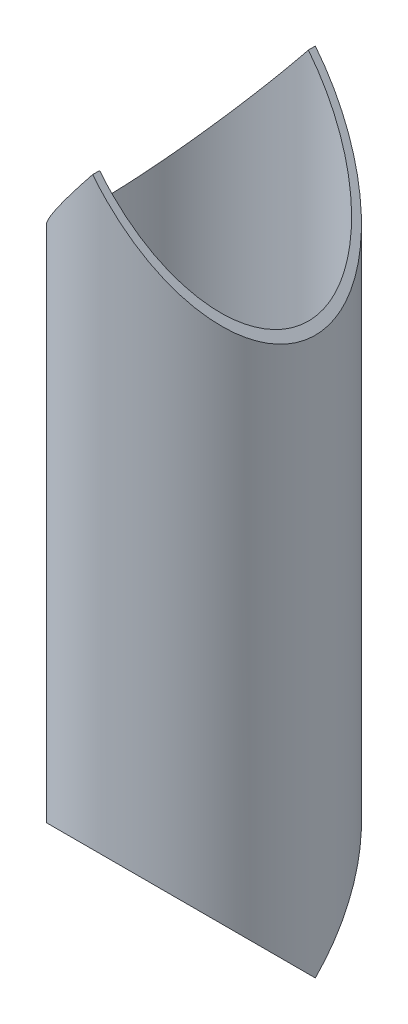
ISO-10303-21;
HEADER;
FILE_DESCRIPTION(('STEP AP214'),'2;1');
FILE_NAME('part.step','',(''),(''),'','','');
FILE_SCHEMA(('AUTOMOTIVE_DESIGN { 1 0 10303 214 1 1 1 1 }'));
ENDSEC;
DATA;
#1=APPLICATION_CONTEXT('core data for automotive mechanical design processes');
#2=APPLICATION_PROTOCOL_DEFINITION('international standard','automotive_design',2000,#1);
#3=PRODUCT_CONTEXT('',#1,'mechanical');
#4=PRODUCT('Part','Part','',(#3));
#5=PRODUCT_RELATED_PRODUCT_CATEGORY('part','',(#4));
#6=PRODUCT_DEFINITION_FORMATION('','',#4);
#7=PRODUCT_DEFINITION_CONTEXT('part definition',#1,'design');
#8=PRODUCT_DEFINITION('design','',#6,#7);
#9=PRODUCT_DEFINITION_SHAPE('','',#8);
#10=(LENGTH_UNIT() NAMED_UNIT(*) SI_UNIT(.MILLI.,.METRE.));
#11=(NAMED_UNIT(*) PLANE_ANGLE_UNIT() SI_UNIT($,.RADIAN.));
#12=(NAMED_UNIT(*) SI_UNIT($,.STERADIAN.) SOLID_ANGLE_UNIT());
#13=UNCERTAINTY_MEASURE_WITH_UNIT(LENGTH_MEASURE(1.E-05),#10,'distance_accuracy_value','');
#14=(GEOMETRIC_REPRESENTATION_CONTEXT(3) GLOBAL_UNCERTAINTY_ASSIGNED_CONTEXT((#13)) GLOBAL_UNIT_ASSIGNED_CONTEXT((#10,
#11,#12)) REPRESENTATION_CONTEXT('',''));
#15=CARTESIAN_POINT('',(0.,0.,0.));
#16=DIRECTION('',(0.,0.,1.));
#17=DIRECTION('',(1.,0.,0.));
#18=AXIS2_PLACEMENT_3D('',#15,#16,#17);
#19=CARTESIAN_POINT('',(0.,158.75,0.));
#20=DIRECTION('',(0.,-1.,0.));
#21=DIRECTION('',(0.,0.,-1.));
#22=AXIS2_PLACEMENT_3D('',#19,#20,#21);
#23=CYLINDRICAL_SURFACE('',#22,25.4);
#24=CARTESIAN_POINT('',(0.,158.75,0.));
#25=DIRECTION('',(0.78086880944303,-0.624695047554424,0.));
#26=DIRECTION('',(-0.624695047554424,-0.78086880944303,0.));
#27=AXIS2_PLACEMENT_3D('',#24,#25,#26);
#28=ELLIPSE('',#27,40.6598389076986,25.4);
#29=CARTESIAN_POINT('',(0.,158.75,25.4));
#30=VERTEX_POINT('',#29);
#31=CARTESIAN_POINT('',(0.,158.75,-25.4));
#32=VERTEX_POINT('',#31);
#33=EDGE_CURVE('E86',#30,#32,#28,.T.);
#34=ORIENTED_EDGE('',*,*,#33,.T.);
#35=CARTESIAN_POINT('',(0.,158.75,0.));
#36=DIRECTION('',(-0.78086880944303,-0.624695047554424,0.));
#37=DIRECTION('',(0.624695047554424,-0.78086880944303,0.));
#38=AXIS2_PLACEMENT_3D('',#35,#36,#37);
#39=ELLIPSE('',#38,40.6598389076986,25.4);
#40=EDGE_CURVE('E84',#32,#30,#39,.T.);
#41=ORIENTED_EDGE('',*,*,#40,.T.);
#42=EDGE_LOOP('',(#34,#41));
#43=FACE_BOUND('',#42,.T.);
#44=CARTESIAN_POINT('',(0.,0.,0.));
#45=DIRECTION('',(0.,0.707106781186548,0.707106781186548));
#46=DIRECTION('',(0.,-0.707106781186548,0.707106781186548));
#47=AXIS2_PLACEMENT_3D('',#44,#45,#46);
#48=ELLIPSE('',#47,35.9210244842766,25.4);
#49=CARTESIAN_POINT('',(25.4,0.,0.));
#50=VERTEX_POINT('',#49);
#51=CARTESIAN_POINT('',(-25.4,0.,0.));
#52=VERTEX_POINT('',#51);
#53=EDGE_CURVE('E45',#50,#52,#48,.T.);
#54=ORIENTED_EDGE('',*,*,#53,.T.);
#55=CARTESIAN_POINT('',(0.,0.,0.));
#56=DIRECTION('',(0.,0.707106781186548,-0.707106781186548));
#57=DIRECTION('',(0.,-0.707106781186548,-0.707106781186548));
#58=AXIS2_PLACEMENT_3D('',#55,#56,#57);
#59=ELLIPSE('',#58,35.9210244842766,25.4);
#60=EDGE_CURVE('E69',#52,#50,#59,.T.);
#61=ORIENTED_EDGE('',*,*,#60,.T.);
#62=EDGE_LOOP('',(#54,#61));
#63=FACE_BOUND('',#62,.T.);
#64=ADVANCED_FACE('F32',(#43,#63),#23,.T.);
#65=CARTESIAN_POINT('',(0.,158.75,0.));
#66=DIRECTION('',(0.,-1.,0.));
#67=DIRECTION('',(0.,0.,-1.));
#68=AXIS2_PLACEMENT_3D('',#65,#66,#67);
#69=CYLINDRICAL_SURFACE('',#68,23.8125);
#70=CARTESIAN_POINT('',(0.,0.,0.));
#71=DIRECTION('',(0.,0.707106781186548,-0.707106781186548));
#72=DIRECTION('',(0.,-0.707106781186548,-0.707106781186548));
#73=AXIS2_PLACEMENT_3D('',#70,#71,#72);
#74=ELLIPSE('',#73,33.6759604540093,23.8125);
#75=CARTESIAN_POINT('',(-23.8125,0.,0.));
#76=VERTEX_POINT('',#75);
#77=CARTESIAN_POINT('',(23.8125,0.,0.));
#78=VERTEX_POINT('',#77);
#79=EDGE_CURVE('E11',#76,#78,#74,.T.);
#80=ORIENTED_EDGE('',*,*,#79,.F.);
#81=CARTESIAN_POINT('',(0.,0.,0.));
#82=DIRECTION('',(0.,0.707106781186548,0.707106781186548));
#83=DIRECTION('',(0.,-0.707106781186548,0.707106781186548));
#84=AXIS2_PLACEMENT_3D('',#81,#82,#83);
#85=ELLIPSE('',#84,33.6759604540093,23.8125);
#86=EDGE_CURVE('E39',#78,#76,#85,.T.);
#87=ORIENTED_EDGE('',*,*,#86,.F.);
#88=EDGE_LOOP('',(#80,#87));
#89=FACE_BOUND('',#88,.T.);
#90=CARTESIAN_POINT('',(0.,158.75,0.));
#91=DIRECTION('',(0.78086880944303,-0.624695047554424,0.));
#92=DIRECTION('',(-0.624695047554424,-0.78086880944303,0.));
#93=AXIS2_PLACEMENT_3D('',#90,#91,#92);
#94=ELLIPSE('',#93,38.1185989759674,23.8125);
#95=CARTESIAN_POINT('',(0.,158.75,23.8125));
#96=VERTEX_POINT('',#95);
#97=CARTESIAN_POINT('',(0.,158.75,-23.8125));
#98=VERTEX_POINT('',#97);
#99=EDGE_CURVE('E90',#96,#98,#94,.T.);
#100=ORIENTED_EDGE('',*,*,#99,.F.);
#101=CARTESIAN_POINT('',(0.,158.75,0.));
#102=DIRECTION('',(-0.78086880944303,-0.624695047554424,0.));
#103=DIRECTION('',(0.624695047554424,-0.78086880944303,0.));
#104=AXIS2_PLACEMENT_3D('',#101,#102,#103);
#105=ELLIPSE('',#104,38.1185989759674,23.8125);
#106=EDGE_CURVE('E88',#98,#96,#105,.T.);
#107=ORIENTED_EDGE('',*,*,#106,.F.);
#108=EDGE_LOOP('',(#100,#107));
#109=FACE_BOUND('',#108,.T.);
#110=ADVANCED_FACE('F93',(#89,#109),#69,.F.);
#111=CARTESIAN_POINT('',(-25.4,127.,-25.4));
#112=DIRECTION('',(0.78086880944303,-0.624695047554424,0.));
#113=DIRECTION('',(0.624695047554424,0.78086880944303,0.));
#114=AXIS2_PLACEMENT_3D('',#111,#112,#113);
#115=PLANE('',#114);
#116=ORIENTED_EDGE('',*,*,#33,.F.);
#117=DIRECTION('',(0.,0.,1.));
#118=VECTOR('',#117,1.);
#119=CARTESIAN_POINT('',(0.,158.75,-25.4));
#120=LINE('',#119,#118);
#121=EDGE_CURVE('E72',#96,#30,#120,.T.);
#122=ORIENTED_EDGE('',*,*,#121,.F.);
#123=ORIENTED_EDGE('',*,*,#99,.T.);
#124=EDGE_CURVE('E82',#32,#98,#120,.T.);
#125=ORIENTED_EDGE('',*,*,#124,.F.);
#126=EDGE_LOOP('',(#116,#122,#123,#125));
#127=FACE_BOUND('',#126,.T.);
#128=ADVANCED_FACE('F96',(#127),#115,.F.);
#129=CARTESIAN_POINT('',(0.,158.75,-25.4));
#130=DIRECTION('',(-0.78086880944303,-0.624695047554424,0.));
#131=DIRECTION('',(0.624695047554424,-0.78086880944303,0.));
#132=AXIS2_PLACEMENT_3D('',#129,#130,#131);
#133=PLANE('',#132);
#134=ORIENTED_EDGE('',*,*,#40,.F.);
#135=ORIENTED_EDGE('',*,*,#124,.T.);
#136=ORIENTED_EDGE('',*,*,#106,.T.);
#137=ORIENTED_EDGE('',*,*,#121,.T.);
#138=EDGE_LOOP('',(#134,#135,#136,#137));
#139=FACE_BOUND('',#138,.T.);
#140=ADVANCED_FACE('F106',(#139),#133,.F.);
#141=CARTESIAN_POINT('',(-25.4,0.,0.));
#142=DIRECTION('',(0.,0.707106781186548,-0.707106781186548));
#143=DIRECTION('',(0.,0.707106781186548,0.707106781186548));
#144=AXIS2_PLACEMENT_3D('',#141,#142,#143);
#145=PLANE('',#144);
#146=DIRECTION('',(1.,0.,0.));
#147=VECTOR('',#146,1.);
#148=CARTESIAN_POINT('',(-25.4,0.,0.));
#149=LINE('',#148,#147);
#150=EDGE_CURVE('E75',#52,#76,#149,.T.);
#151=ORIENTED_EDGE('',*,*,#150,.T.);
#152=ORIENTED_EDGE('',*,*,#79,.T.);
#153=EDGE_CURVE('E52',#78,#50,#149,.T.);
#154=ORIENTED_EDGE('',*,*,#153,.T.);
#155=ORIENTED_EDGE('',*,*,#60,.F.);
#156=EDGE_LOOP('',(#151,#152,#154,#155));
#157=FACE_BOUND('',#156,.T.);
#158=ADVANCED_FACE('F77',(#157),#145,.F.);
#159=CARTESIAN_POINT('',(-25.4,25.4,-25.4));
#160=DIRECTION('',(0.,0.707106781186548,0.707106781186548));
#161=DIRECTION('',(0.,-0.707106781186548,0.707106781186548));
#162=AXIS2_PLACEMENT_3D('',#159,#160,#161);
#163=PLANE('',#162);
#164=ORIENTED_EDGE('',*,*,#153,.F.);
#165=ORIENTED_EDGE('',*,*,#86,.T.);
#166=ORIENTED_EDGE('',*,*,#150,.F.);
#167=ORIENTED_EDGE('',*,*,#53,.F.);
#168=EDGE_LOOP('',(#164,#165,#166,#167));
#169=FACE_BOUND('',#168,.T.);
#170=ADVANCED_FACE('F74',(#169),#163,.F.);
#171=CLOSED_SHELL('',(#64,#110,#128,#140,#158,#170));
#172=MANIFOLD_SOLID_BREP('B2',#171);
#173=ADVANCED_BREP_SHAPE_REPRESENTATION('',(#18,#172),#14);
#174=SHAPE_DEFINITION_REPRESENTATION(#9,#173);
ENDSEC;
END-ISO-10303-21;
